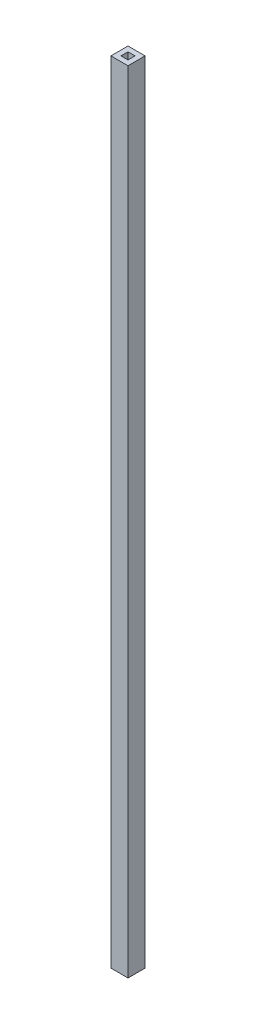
ISO-10303-21;
HEADER;
FILE_DESCRIPTION(('STEP AP214'),'2;1');
FILE_NAME('part.step','',(''),(''),'','','');
FILE_SCHEMA(('AUTOMOTIVE_DESIGN { 1 0 10303 214 1 1 1 1 }'));
ENDSEC;
DATA;
#1=APPLICATION_CONTEXT('core data for automotive mechanical design processes');
#2=APPLICATION_PROTOCOL_DEFINITION('international standard','automotive_design',2000,#1);
#3=PRODUCT_CONTEXT('',#1,'mechanical');
#4=PRODUCT('Part','Part','',(#3));
#5=PRODUCT_RELATED_PRODUCT_CATEGORY('part','',(#4));
#6=PRODUCT_DEFINITION_FORMATION('','',#4);
#7=PRODUCT_DEFINITION_CONTEXT('part definition',#1,'design');
#8=PRODUCT_DEFINITION('design','',#6,#7);
#9=PRODUCT_DEFINITION_SHAPE('','',#8);
#10=(LENGTH_UNIT() NAMED_UNIT(*) SI_UNIT(.MILLI.,.METRE.));
#11=(NAMED_UNIT(*) PLANE_ANGLE_UNIT() SI_UNIT($,.RADIAN.));
#12=(NAMED_UNIT(*) SI_UNIT($,.STERADIAN.) SOLID_ANGLE_UNIT());
#13=UNCERTAINTY_MEASURE_WITH_UNIT(LENGTH_MEASURE(1.E-05),#10,'distance_accuracy_value','');
#14=(GEOMETRIC_REPRESENTATION_CONTEXT(3) GLOBAL_UNCERTAINTY_ASSIGNED_CONTEXT((#13)) GLOBAL_UNIT_ASSIGNED_CONTEXT((#10,
#11,#12)) REPRESENTATION_CONTEXT('',''));
#15=CARTESIAN_POINT('',(0.,0.,0.));
#16=DIRECTION('',(0.,0.,1.));
#17=DIRECTION('',(1.,0.,0.));
#18=AXIS2_PLACEMENT_3D('',#15,#16,#17);
#19=CARTESIAN_POINT('',(0.,2346.325,0.));
#20=DIRECTION('',(0.,1.,0.));
#21=DIRECTION('',(0.,0.,1.));
#22=AXIS2_PLACEMENT_3D('',#19,#20,#21);
#23=PLANE('',#22);
#24=DIRECTION('',(0.,0.,-1.));
#25=VECTOR('',#24,1.);
#26=CARTESIAN_POINT('',(25.4,2346.325,-25.4));
#27=LINE('',#26,#25);
#28=CARTESIAN_POINT('',(25.4,2346.325,25.4));
#29=VERTEX_POINT('',#28);
#30=CARTESIAN_POINT('',(25.4,2346.325,-25.4));
#31=VERTEX_POINT('',#30);
#32=EDGE_CURVE('E153',#29,#31,#27,.T.);
#33=ORIENTED_EDGE('',*,*,#32,.T.);
#34=DIRECTION('',(-1.,0.,0.));
#35=VECTOR('',#34,1.);
#36=CARTESIAN_POINT('',(-25.4,2346.325,-25.4));
#37=LINE('',#36,#35);
#38=CARTESIAN_POINT('',(-25.4,2346.325,-25.4));
#39=VERTEX_POINT('',#38);
#40=EDGE_CURVE('E157',#31,#39,#37,.T.);
#41=ORIENTED_EDGE('',*,*,#40,.T.);
#42=DIRECTION('',(0.,0.,1.));
#43=VECTOR('',#42,1.);
#44=CARTESIAN_POINT('',(-25.4,2346.325,-25.4));
#45=LINE('',#44,#43);
#46=CARTESIAN_POINT('',(-25.4,2346.325,25.4));
#47=VERTEX_POINT('',#46);
#48=EDGE_CURVE('E161',#39,#47,#45,.T.);
#49=ORIENTED_EDGE('',*,*,#48,.T.);
#50=DIRECTION('',(1.,0.,0.));
#51=VECTOR('',#50,1.);
#52=CARTESIAN_POINT('',(-25.4,2346.325,25.4));
#53=LINE('',#52,#51);
#54=EDGE_CURVE('E164',#47,#29,#53,.T.);
#55=ORIENTED_EDGE('',*,*,#54,.T.);
#56=EDGE_LOOP('',(#33,#41,#49,#55));
#57=FACE_BOUND('',#56,.T.);
#58=DIRECTION('',(-1.,0.,0.));
#59=VECTOR('',#58,1.);
#60=CARTESIAN_POINT('',(-10.4,2346.325,-10.4));
#61=LINE('',#60,#59);
#62=CARTESIAN_POINT('',(10.4,2346.325,-10.4));
#63=VERTEX_POINT('',#62);
#64=CARTESIAN_POINT('',(-10.4,2346.325,-10.4));
#65=VERTEX_POINT('',#64);
#66=EDGE_CURVE('E114',#63,#65,#61,.T.);
#67=ORIENTED_EDGE('',*,*,#66,.F.);
#68=DIRECTION('',(0.,0.,-1.));
#69=VECTOR('',#68,1.);
#70=CARTESIAN_POINT('',(10.4,2346.325,-10.4));
#71=LINE('',#70,#69);
#72=CARTESIAN_POINT('',(10.4,2346.325,10.4));
#73=VERTEX_POINT('',#72);
#74=EDGE_CURVE('E105',#73,#63,#71,.T.);
#75=ORIENTED_EDGE('',*,*,#74,.F.);
#76=DIRECTION('',(1.,0.,0.));
#77=VECTOR('',#76,1.);
#78=CARTESIAN_POINT('',(-10.4,2346.325,10.4));
#79=LINE('',#78,#77);
#80=CARTESIAN_POINT('',(-10.4,2346.325,10.4));
#81=VERTEX_POINT('',#80);
#82=EDGE_CURVE('E131',#81,#73,#79,.T.);
#83=ORIENTED_EDGE('',*,*,#82,.F.);
#84=DIRECTION('',(0.,0.,1.));
#85=VECTOR('',#84,1.);
#86=CARTESIAN_POINT('',(-10.4,2346.325,-10.4));
#87=LINE('',#86,#85);
#88=EDGE_CURVE('E127',#65,#81,#87,.T.);
#89=ORIENTED_EDGE('',*,*,#88,.F.);
#90=EDGE_LOOP('',(#67,#75,#83,#89));
#91=FACE_BOUND('',#90,.T.);
#92=ADVANCED_FACE('F39',(#57,#91),#23,.T.);
#93=CARTESIAN_POINT('',(0.,0.,0.));
#94=DIRECTION('',(0.,1.,0.));
#95=DIRECTION('',(0.,0.,1.));
#96=AXIS2_PLACEMENT_3D('',#93,#94,#95);
#97=PLANE('',#96);
#98=DIRECTION('',(0.,0.,-1.));
#99=VECTOR('',#98,1.);
#100=CARTESIAN_POINT('',(25.4,0.,-25.4));
#101=LINE('',#100,#99);
#102=CARTESIAN_POINT('',(25.4,0.,25.4));
#103=VERTEX_POINT('',#102);
#104=CARTESIAN_POINT('',(25.4,0.,-25.4));
#105=VERTEX_POINT('',#104);
#106=EDGE_CURVE('E123',#103,#105,#101,.T.);
#107=ORIENTED_EDGE('',*,*,#106,.F.);
#108=DIRECTION('',(1.,0.,0.));
#109=VECTOR('',#108,1.);
#110=CARTESIAN_POINT('',(-25.4,0.,25.4));
#111=LINE('',#110,#109);
#112=CARTESIAN_POINT('',(-25.4,0.,25.4));
#113=VERTEX_POINT('',#112);
#114=EDGE_CURVE('E158',#113,#103,#111,.T.);
#115=ORIENTED_EDGE('',*,*,#114,.F.);
#116=DIRECTION('',(0.,0.,1.));
#117=VECTOR('',#116,1.);
#118=CARTESIAN_POINT('',(-25.4,0.,-25.4));
#119=LINE('',#118,#117);
#120=CARTESIAN_POINT('',(-25.4,0.,-25.4));
#121=VERTEX_POINT('',#120);
#122=EDGE_CURVE('E174',#121,#113,#119,.T.);
#123=ORIENTED_EDGE('',*,*,#122,.F.);
#124=DIRECTION('',(-1.,0.,0.));
#125=VECTOR('',#124,1.);
#126=CARTESIAN_POINT('',(-25.4,0.,-25.4));
#127=LINE('',#126,#125);
#128=EDGE_CURVE('E171',#105,#121,#127,.T.);
#129=ORIENTED_EDGE('',*,*,#128,.F.);
#130=EDGE_LOOP('',(#107,#115,#123,#129));
#131=FACE_BOUND('',#130,.T.);
#132=DIRECTION('',(0.,0.,-1.));
#133=VECTOR('',#132,1.);
#134=CARTESIAN_POINT('',(10.4,0.,-10.4));
#135=LINE('',#134,#133);
#136=CARTESIAN_POINT('',(10.4,0.,10.4));
#137=VERTEX_POINT('',#136);
#138=CARTESIAN_POINT('',(10.4,0.,-10.4));
#139=VERTEX_POINT('',#138);
#140=EDGE_CURVE('E63',#137,#139,#135,.T.);
#141=ORIENTED_EDGE('',*,*,#140,.T.);
#142=DIRECTION('',(-1.,0.,0.));
#143=VECTOR('',#142,1.);
#144=CARTESIAN_POINT('',(-10.4,0.,-10.4));
#145=LINE('',#144,#143);
#146=CARTESIAN_POINT('',(-10.4,0.,-10.4));
#147=VERTEX_POINT('',#146);
#148=EDGE_CURVE('E121',#139,#147,#145,.T.);
#149=ORIENTED_EDGE('',*,*,#148,.T.);
#150=DIRECTION('',(0.,0.,1.));
#151=VECTOR('',#150,1.);
#152=CARTESIAN_POINT('',(-10.4,0.,-10.4));
#153=LINE('',#152,#151);
#154=CARTESIAN_POINT('',(-10.4,0.,10.4));
#155=VERTEX_POINT('',#154);
#156=EDGE_CURVE('E140',#147,#155,#153,.T.);
#157=ORIENTED_EDGE('',*,*,#156,.T.);
#158=DIRECTION('',(1.,0.,0.));
#159=VECTOR('',#158,1.);
#160=CARTESIAN_POINT('',(-10.4,0.,10.4));
#161=LINE('',#160,#159);
#162=EDGE_CURVE('E115',#155,#137,#161,.T.);
#163=ORIENTED_EDGE('',*,*,#162,.T.);
#164=EDGE_LOOP('',(#141,#149,#157,#163));
#165=FACE_BOUND('',#164,.T.);
#166=ADVANCED_FACE('F197',(#131,#165),#97,.F.);
#167=CARTESIAN_POINT('',(25.4,2346.325,-25.4));
#168=DIRECTION('',(-1.,0.,0.));
#169=DIRECTION('',(0.,0.,1.));
#170=AXIS2_PLACEMENT_3D('',#167,#168,#169);
#171=PLANE('',#170);
#172=ORIENTED_EDGE('',*,*,#106,.T.);
#173=DIRECTION('',(0.,-1.,0.));
#174=VECTOR('',#173,1.);
#175=CARTESIAN_POINT('',(25.4,2346.325,-25.4));
#176=LINE('',#175,#174);
#177=EDGE_CURVE('E11',#31,#105,#176,.T.);
#178=ORIENTED_EDGE('',*,*,#177,.F.);
#179=ORIENTED_EDGE('',*,*,#32,.F.);
#180=DIRECTION('',(0.,-1.,0.));
#181=VECTOR('',#180,1.);
#182=CARTESIAN_POINT('',(25.4,2346.325,25.4));
#183=LINE('',#182,#181);
#184=EDGE_CURVE('E167',#29,#103,#183,.T.);
#185=ORIENTED_EDGE('',*,*,#184,.T.);
#186=EDGE_LOOP('',(#172,#178,#179,#185));
#187=FACE_BOUND('',#186,.T.);
#188=ADVANCED_FACE('F41',(#187),#171,.F.);
#189=CARTESIAN_POINT('',(-25.4,2346.325,-25.4));
#190=DIRECTION('',(0.,0.,1.));
#191=DIRECTION('',(1.,0.,0.));
#192=AXIS2_PLACEMENT_3D('',#189,#190,#191);
#193=PLANE('',#192);
#194=ORIENTED_EDGE('',*,*,#128,.T.);
#195=DIRECTION('',(0.,-1.,0.));
#196=VECTOR('',#195,1.);
#197=CARTESIAN_POINT('',(-25.4,2346.325,-25.4));
#198=LINE('',#197,#196);
#199=EDGE_CURVE('E48',#39,#121,#198,.T.);
#200=ORIENTED_EDGE('',*,*,#199,.F.);
#201=ORIENTED_EDGE('',*,*,#40,.F.);
#202=ORIENTED_EDGE('',*,*,#177,.T.);
#203=EDGE_LOOP('',(#194,#200,#201,#202));
#204=FACE_BOUND('',#203,.T.);
#205=ADVANCED_FACE('F207',(#204),#193,.F.);
#206=CARTESIAN_POINT('',(-25.4,2346.325,-25.4));
#207=DIRECTION('',(1.,0.,0.));
#208=DIRECTION('',(0.,0.,-1.));
#209=AXIS2_PLACEMENT_3D('',#206,#207,#208);
#210=PLANE('',#209);
#211=ORIENTED_EDGE('',*,*,#122,.T.);
#212=DIRECTION('',(0.,-1.,0.));
#213=VECTOR('',#212,1.);
#214=CARTESIAN_POINT('',(-25.4,2346.325,25.4));
#215=LINE('',#214,#213);
#216=EDGE_CURVE('E182',#47,#113,#215,.T.);
#217=ORIENTED_EDGE('',*,*,#216,.F.);
#218=ORIENTED_EDGE('',*,*,#48,.F.);
#219=ORIENTED_EDGE('',*,*,#199,.T.);
#220=EDGE_LOOP('',(#211,#217,#218,#219));
#221=FACE_BOUND('',#220,.T.);
#222=ADVANCED_FACE('F191',(#221),#210,.F.);
#223=CARTESIAN_POINT('',(-25.4,2346.325,25.4));
#224=DIRECTION('',(0.,0.,-1.));
#225=DIRECTION('',(-1.,0.,0.));
#226=AXIS2_PLACEMENT_3D('',#223,#224,#225);
#227=PLANE('',#226);
#228=ORIENTED_EDGE('',*,*,#114,.T.);
#229=ORIENTED_EDGE('',*,*,#184,.F.);
#230=ORIENTED_EDGE('',*,*,#54,.F.);
#231=ORIENTED_EDGE('',*,*,#216,.T.);
#232=EDGE_LOOP('',(#228,#229,#230,#231));
#233=FACE_BOUND('',#232,.T.);
#234=ADVANCED_FACE('F201',(#233),#227,.F.);
#235=CARTESIAN_POINT('',(10.4,2346.325,-10.4));
#236=DIRECTION('',(-1.,0.,0.));
#237=DIRECTION('',(0.,0.,1.));
#238=AXIS2_PLACEMENT_3D('',#235,#236,#237);
#239=PLANE('',#238);
#240=ORIENTED_EDGE('',*,*,#140,.F.);
#241=DIRECTION('',(0.,-1.,0.));
#242=VECTOR('',#241,1.);
#243=CARTESIAN_POINT('',(10.4,2346.325,10.4));
#244=LINE('',#243,#242);
#245=EDGE_CURVE('E109',#73,#137,#244,.T.);
#246=ORIENTED_EDGE('',*,*,#245,.F.);
#247=ORIENTED_EDGE('',*,*,#74,.T.);
#248=DIRECTION('',(0.,-1.,0.));
#249=VECTOR('',#248,1.);
#250=CARTESIAN_POINT('',(10.4,2346.325,-10.4));
#251=LINE('',#250,#249);
#252=EDGE_CURVE('E108',#63,#139,#251,.T.);
#253=ORIENTED_EDGE('',*,*,#252,.T.);
#254=EDGE_LOOP('',(#240,#246,#247,#253));
#255=FACE_BOUND('',#254,.T.);
#256=ADVANCED_FACE('F107',(#255),#239,.T.);
#257=CARTESIAN_POINT('',(-10.4,2346.325,-10.4));
#258=DIRECTION('',(0.,0.,1.));
#259=DIRECTION('',(1.,0.,0.));
#260=AXIS2_PLACEMENT_3D('',#257,#258,#259);
#261=PLANE('',#260);
#262=ORIENTED_EDGE('',*,*,#148,.F.);
#263=ORIENTED_EDGE('',*,*,#252,.F.);
#264=ORIENTED_EDGE('',*,*,#66,.T.);
#265=DIRECTION('',(0.,-1.,0.));
#266=VECTOR('',#265,1.);
#267=CARTESIAN_POINT('',(-10.4,2346.325,-10.4));
#268=LINE('',#267,#266);
#269=EDGE_CURVE('E124',#65,#147,#268,.T.);
#270=ORIENTED_EDGE('',*,*,#269,.T.);
#271=EDGE_LOOP('',(#262,#263,#264,#270));
#272=FACE_BOUND('',#271,.T.);
#273=ADVANCED_FACE('F118',(#272),#261,.T.);
#274=CARTESIAN_POINT('',(-10.4,2346.325,-10.4));
#275=DIRECTION('',(1.,0.,0.));
#276=DIRECTION('',(0.,0.,-1.));
#277=AXIS2_PLACEMENT_3D('',#274,#275,#276);
#278=PLANE('',#277);
#279=ORIENTED_EDGE('',*,*,#156,.F.);
#280=ORIENTED_EDGE('',*,*,#269,.F.);
#281=ORIENTED_EDGE('',*,*,#88,.T.);
#282=DIRECTION('',(0.,-1.,0.));
#283=VECTOR('',#282,1.);
#284=CARTESIAN_POINT('',(-10.4,2346.325,10.4));
#285=LINE('',#284,#283);
#286=EDGE_CURVE('E55',#81,#155,#285,.T.);
#287=ORIENTED_EDGE('',*,*,#286,.T.);
#288=EDGE_LOOP('',(#279,#280,#281,#287));
#289=FACE_BOUND('',#288,.T.);
#290=ADVANCED_FACE('F230',(#289),#278,.T.);
#291=CARTESIAN_POINT('',(-10.4,2346.325,10.4));
#292=DIRECTION('',(0.,0.,-1.));
#293=DIRECTION('',(-1.,0.,0.));
#294=AXIS2_PLACEMENT_3D('',#291,#292,#293);
#295=PLANE('',#294);
#296=ORIENTED_EDGE('',*,*,#162,.F.);
#297=ORIENTED_EDGE('',*,*,#286,.F.);
#298=ORIENTED_EDGE('',*,*,#82,.T.);
#299=ORIENTED_EDGE('',*,*,#245,.T.);
#300=EDGE_LOOP('',(#296,#297,#298,#299));
#301=FACE_BOUND('',#300,.T.);
#302=ADVANCED_FACE('F234',(#301),#295,.T.);
#303=CLOSED_SHELL('',(#92,#166,#188,#205,#222,#234,#256,#273,#290,#302));
#304=MANIFOLD_SOLID_BREP('B2',#303);
#305=ADVANCED_BREP_SHAPE_REPRESENTATION('',(#18,#304),#14);
#306=SHAPE_DEFINITION_REPRESENTATION(#9,#305);
ENDSEC;
END-ISO-10303-21;
